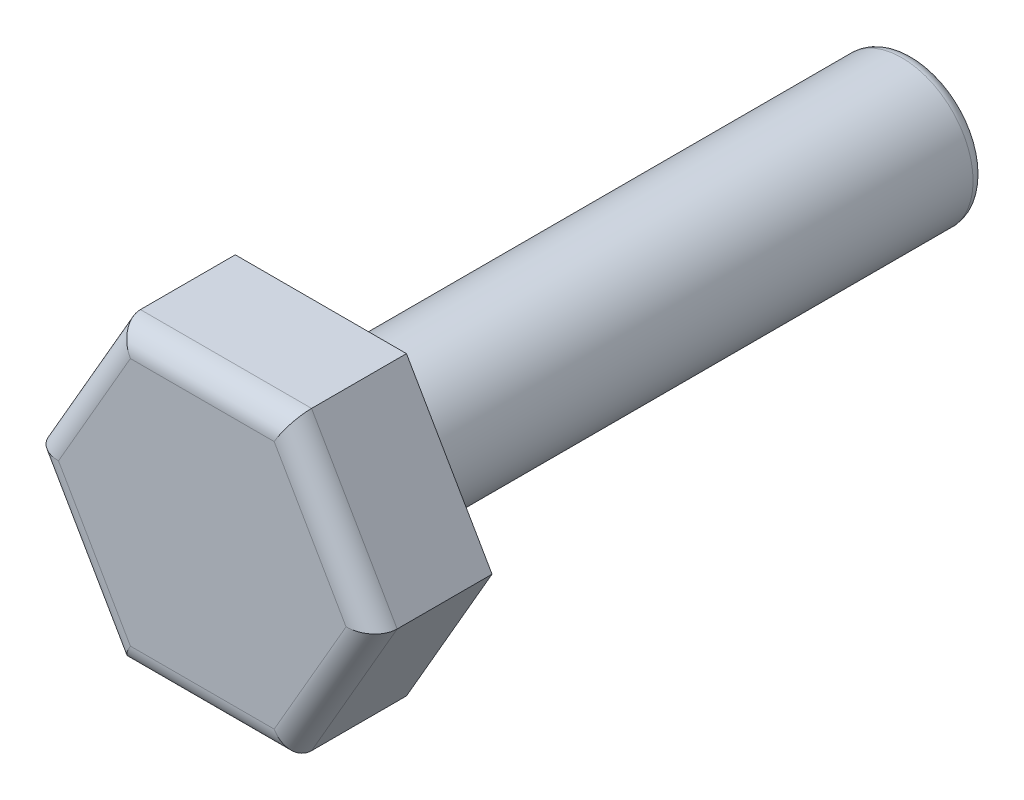
ISO-10303-21;
HEADER;
FILE_DESCRIPTION(('STEP AP214'),'2;1');
FILE_NAME('part.step','',(''),(''),'','','');
FILE_SCHEMA(('AUTOMOTIVE_DESIGN { 1 0 10303 214 1 1 1 1 }'));
ENDSEC;
DATA;
#1=APPLICATION_CONTEXT('core data for automotive mechanical design processes');
#2=APPLICATION_PROTOCOL_DEFINITION('international standard','automotive_design',2000,#1);
#3=PRODUCT_CONTEXT('',#1,'mechanical');
#4=PRODUCT('Part','Part','',(#3));
#5=PRODUCT_RELATED_PRODUCT_CATEGORY('part','',(#4));
#6=PRODUCT_DEFINITION_FORMATION('','',#4);
#7=PRODUCT_DEFINITION_CONTEXT('part definition',#1,'design');
#8=PRODUCT_DEFINITION('design','',#6,#7);
#9=PRODUCT_DEFINITION_SHAPE('','',#8);
#10=(LENGTH_UNIT() NAMED_UNIT(*) SI_UNIT(.MILLI.,.METRE.));
#11=(NAMED_UNIT(*) PLANE_ANGLE_UNIT() SI_UNIT($,.RADIAN.));
#12=(NAMED_UNIT(*) SI_UNIT($,.STERADIAN.) SOLID_ANGLE_UNIT());
#13=UNCERTAINTY_MEASURE_WITH_UNIT(LENGTH_MEASURE(1.E-05),#10,'distance_accuracy_value','');
#14=(GEOMETRIC_REPRESENTATION_CONTEXT(3) GLOBAL_UNCERTAINTY_ASSIGNED_CONTEXT((#13)) GLOBAL_UNIT_ASSIGNED_CONTEXT((#10,
#11,#12)) REPRESENTATION_CONTEXT('',''));
#15=CARTESIAN_POINT('',(0.,0.,0.));
#16=DIRECTION('',(0.,0.,1.));
#17=DIRECTION('',(1.,0.,0.));
#18=AXIS2_PLACEMENT_3D('',#15,#16,#17);
#19=CARTESIAN_POINT('',(0.,0.,60.));
#20=DIRECTION('',(0.,0.,-1.));
#21=DIRECTION('',(-1.,0.,0.));
#22=AXIS2_PLACEMENT_3D('',#19,#20,#21);
#23=CYLINDRICAL_SURFACE('',#22,6.);
#24=CARTESIAN_POINT('',(0.,0.,1.));
#25=DIRECTION('',(0.,0.,1.));
#26=DIRECTION('',(1.,0.,0.));
#27=AXIS2_PLACEMENT_3D('',#24,#25,#26);
#28=CIRCLE('',#27,6.);
#29=CARTESIAN_POINT('',(6.,0.,1.));
#30=VERTEX_POINT('',#29);
#31=EDGE_CURVE('E42',#30,#30,#28,.T.);
#32=ORIENTED_EDGE('',*,*,#31,.T.);
#33=EDGE_LOOP('',(#32));
#34=FACE_BOUND('',#33,.T.);
#35=CARTESIAN_POINT('',(0.,0.,50.));
#36=DIRECTION('',(0.,0.,1.));
#37=DIRECTION('',(1.,0.,0.));
#38=AXIS2_PLACEMENT_3D('',#35,#36,#37);
#39=CIRCLE('',#38,6.);
#40=CARTESIAN_POINT('',(6.,0.,50.));
#41=VERTEX_POINT('',#40);
#42=EDGE_CURVE('E149',#41,#41,#39,.T.);
#43=ORIENTED_EDGE('',*,*,#42,.F.);
#44=EDGE_LOOP('',(#43));
#45=FACE_BOUND('',#44,.T.);
#46=ADVANCED_FACE('F34',(#34,#45),#23,.T.);
#47=CARTESIAN_POINT('',(0.,0.,0.));
#48=DIRECTION('',(0.,0.,1.));
#49=DIRECTION('',(1.,0.,0.));
#50=AXIS2_PLACEMENT_3D('',#47,#48,#49);
#51=PLANE('',#50);
#52=CARTESIAN_POINT('',(0.,0.,0.));
#53=DIRECTION('',(0.,0.,1.));
#54=DIRECTION('',(1.,0.,0.));
#55=AXIS2_PLACEMENT_3D('',#52,#53,#54);
#56=CIRCLE('',#55,5.);
#57=CARTESIAN_POINT('',(5.,0.,0.));
#58=VERTEX_POINT('',#57);
#59=EDGE_CURVE('E11',#58,#58,#56,.F.);
#60=ORIENTED_EDGE('',*,*,#59,.T.);
#61=EDGE_LOOP('',(#60));
#62=FACE_BOUND('',#61,.T.);
#63=ADVANCED_FACE('F208',(#62),#51,.F.);
#64=CARTESIAN_POINT('',(0.,0.,50.));
#65=DIRECTION('',(0.,0.,1.));
#66=DIRECTION('',(1.,0.,0.));
#67=AXIS2_PLACEMENT_3D('',#64,#65,#66);
#68=PLANE('',#67);
#69=DIRECTION('',(1.,0.,0.));
#70=VECTOR('',#69,1.);
#71=CARTESIAN_POINT('',(-7.21687836487032,-12.5,50.));
#72=LINE('',#71,#70);
#73=CARTESIAN_POINT('',(-7.21687836487032,-12.5,50.));
#74=VERTEX_POINT('',#73);
#75=CARTESIAN_POINT('',(7.21687836487032,-12.5,50.));
#76=VERTEX_POINT('',#75);
#77=EDGE_CURVE('E125',#74,#76,#72,.T.);
#78=ORIENTED_EDGE('',*,*,#77,.F.);
#79=DIRECTION('',(0.5,-0.866025403784439,0.));
#80=VECTOR('',#79,1.);
#81=CARTESIAN_POINT('',(-14.4337567297406,0.,50.));
#82=LINE('',#81,#80);
#83=CARTESIAN_POINT('',(-14.4337567297406,0.,50.));
#84=VERTEX_POINT('',#83);
#85=EDGE_CURVE('E117',#84,#74,#82,.T.);
#86=ORIENTED_EDGE('',*,*,#85,.F.);
#87=DIRECTION('',(-0.5,-0.866025403784439,0.));
#88=VECTOR('',#87,1.);
#89=CARTESIAN_POINT('',(-7.21687836487033,12.5,50.));
#90=LINE('',#89,#88);
#91=CARTESIAN_POINT('',(-7.21687836487033,12.5,50.));
#92=VERTEX_POINT('',#91);
#93=EDGE_CURVE('E144',#92,#84,#90,.T.);
#94=ORIENTED_EDGE('',*,*,#93,.F.);
#95=DIRECTION('',(-1.,0.,0.));
#96=VECTOR('',#95,1.);
#97=CARTESIAN_POINT('',(7.21687836487033,12.5,50.));
#98=LINE('',#97,#96);
#99=CARTESIAN_POINT('',(7.21687836487033,12.5,50.));
#100=VERTEX_POINT('',#99);
#101=EDGE_CURVE('E141',#100,#92,#98,.T.);
#102=ORIENTED_EDGE('',*,*,#101,.F.);
#103=DIRECTION('',(-0.5,0.866025403784439,0.));
#104=VECTOR('',#103,1.);
#105=CARTESIAN_POINT('',(14.4337567297406,0.,50.));
#106=LINE('',#105,#104);
#107=CARTESIAN_POINT('',(14.4337567297406,0.,50.));
#108=VERTEX_POINT('',#107);
#109=EDGE_CURVE('E129',#108,#100,#106,.T.);
#110=ORIENTED_EDGE('',*,*,#109,.F.);
#111=DIRECTION('',(0.5,0.866025403784439,0.));
#112=VECTOR('',#111,1.);
#113=CARTESIAN_POINT('',(7.21687836487032,-12.5,50.));
#114=LINE('',#113,#112);
#115=EDGE_CURVE('E111',#76,#108,#114,.T.);
#116=ORIENTED_EDGE('',*,*,#115,.F.);
#117=EDGE_LOOP('',(#78,#86,#94,#102,#110,#116));
#118=FACE_BOUND('',#117,.T.);
#119=ORIENTED_EDGE('',*,*,#42,.T.);
#120=EDGE_LOOP('',(#119));
#121=FACE_BOUND('',#120,.T.);
#122=ADVANCED_FACE('F122',(#118,#121),#68,.F.);
#123=CARTESIAN_POINT('',(-7.21687836487032,-12.5,50.));
#124=DIRECTION('',(0.,-1.,0.));
#125=DIRECTION('',(1.,0.,0.));
#126=AXIS2_PLACEMENT_3D('',#123,#124,#125);
#127=PLANE('',#126);
#128=DIRECTION('',(0.,0.,1.));
#129=VECTOR('',#128,1.);
#130=CARTESIAN_POINT('',(7.21687836487032,-12.5,50.));
#131=LINE('',#130,#129);
#132=CARTESIAN_POINT('',(7.21687836487032,-12.5,58.));
#133=VERTEX_POINT('',#132);
#134=EDGE_CURVE('E107',#76,#133,#131,.T.);
#135=ORIENTED_EDGE('',*,*,#134,.T.);
#136=DIRECTION('',(1.,0.,0.));
#137=VECTOR('',#136,1.);
#138=CARTESIAN_POINT('',(-7.21687836487032,-12.5,58.));
#139=LINE('',#138,#137);
#140=CARTESIAN_POINT('',(-7.21687836487032,-12.5,58.));
#141=VERTEX_POINT('',#140);
#142=EDGE_CURVE('E173',#133,#141,#139,.F.);
#143=ORIENTED_EDGE('',*,*,#142,.T.);
#144=DIRECTION('',(0.,0.,1.));
#145=VECTOR('',#144,1.);
#146=CARTESIAN_POINT('',(-7.21687836487032,-12.5,50.));
#147=LINE('',#146,#145);
#148=EDGE_CURVE('E133',#74,#141,#147,.T.);
#149=ORIENTED_EDGE('',*,*,#148,.F.);
#150=ORIENTED_EDGE('',*,*,#77,.T.);
#151=EDGE_LOOP('',(#135,#143,#149,#150));
#152=FACE_BOUND('',#151,.T.);
#153=ADVANCED_FACE('F131',(#152),#127,.T.);
#154=CARTESIAN_POINT('',(-14.4337567297406,0.,50.));
#155=DIRECTION('',(-0.866025403784439,-0.5,0.));
#156=DIRECTION('',(0.5,-0.866025403784439,0.));
#157=AXIS2_PLACEMENT_3D('',#154,#155,#156);
#158=PLANE('',#157);
#159=ORIENTED_EDGE('',*,*,#148,.T.);
#160=DIRECTION('',(0.5,-0.866025403784439,0.));
#161=VECTOR('',#160,1.);
#162=CARTESIAN_POINT('',(-14.4337567297406,0.,58.));
#163=LINE('',#162,#161);
#164=CARTESIAN_POINT('',(-14.4337567297406,0.,58.));
#165=VERTEX_POINT('',#164);
#166=EDGE_CURVE('E175',#141,#165,#163,.F.);
#167=ORIENTED_EDGE('',*,*,#166,.T.);
#168=DIRECTION('',(0.,0.,1.));
#169=VECTOR('',#168,1.);
#170=CARTESIAN_POINT('',(-14.4337567297406,0.,50.));
#171=LINE('',#170,#169);
#172=EDGE_CURVE('E150',#84,#165,#171,.T.);
#173=ORIENTED_EDGE('',*,*,#172,.F.);
#174=ORIENTED_EDGE('',*,*,#85,.T.);
#175=EDGE_LOOP('',(#159,#167,#173,#174));
#176=FACE_BOUND('',#175,.T.);
#177=ADVANCED_FACE('F256',(#176),#158,.T.);
#178=CARTESIAN_POINT('',(-7.21687836487033,12.5,50.));
#179=DIRECTION('',(-0.866025403784439,0.5,0.));
#180=DIRECTION('',(-0.5,-0.866025403784439,0.));
#181=AXIS2_PLACEMENT_3D('',#178,#179,#180);
#182=PLANE('',#181);
#183=ORIENTED_EDGE('',*,*,#172,.T.);
#184=DIRECTION('',(-0.5,-0.866025403784439,0.));
#185=VECTOR('',#184,1.);
#186=CARTESIAN_POINT('',(-7.21687836487033,12.5,58.));
#187=LINE('',#186,#185);
#188=CARTESIAN_POINT('',(-7.21687836487033,12.5,58.));
#189=VERTEX_POINT('',#188);
#190=EDGE_CURVE('E57',#165,#189,#187,.F.);
#191=ORIENTED_EDGE('',*,*,#190,.T.);
#192=DIRECTION('',(0.,0.,1.));
#193=VECTOR('',#192,1.);
#194=CARTESIAN_POINT('',(-7.21687836487033,12.5,50.));
#195=LINE('',#194,#193);
#196=EDGE_CURVE('E152',#92,#189,#195,.T.);
#197=ORIENTED_EDGE('',*,*,#196,.F.);
#198=ORIENTED_EDGE('',*,*,#93,.T.);
#199=EDGE_LOOP('',(#183,#191,#197,#198));
#200=FACE_BOUND('',#199,.T.);
#201=ADVANCED_FACE('F260',(#200),#182,.T.);
#202=CARTESIAN_POINT('',(7.21687836487033,12.5,50.));
#203=DIRECTION('',(0.,1.,0.));
#204=DIRECTION('',(-1.,0.,0.));
#205=AXIS2_PLACEMENT_3D('',#202,#203,#204);
#206=PLANE('',#205);
#207=ORIENTED_EDGE('',*,*,#196,.T.);
#208=DIRECTION('',(-1.,0.,0.));
#209=VECTOR('',#208,1.);
#210=CARTESIAN_POINT('',(7.21687836487033,12.5,58.));
#211=LINE('',#210,#209);
#212=CARTESIAN_POINT('',(7.21687836487033,12.5,58.));
#213=VERTEX_POINT('',#212);
#214=EDGE_CURVE('E49',#189,#213,#211,.F.);
#215=ORIENTED_EDGE('',*,*,#214,.T.);
#216=DIRECTION('',(0.,0.,1.));
#217=VECTOR('',#216,1.);
#218=CARTESIAN_POINT('',(7.21687836487033,12.5,50.));
#219=LINE('',#218,#217);
#220=EDGE_CURVE('E154',#100,#213,#219,.T.);
#221=ORIENTED_EDGE('',*,*,#220,.F.);
#222=ORIENTED_EDGE('',*,*,#101,.T.);
#223=EDGE_LOOP('',(#207,#215,#221,#222));
#224=FACE_BOUND('',#223,.T.);
#225=ADVANCED_FACE('F259',(#224),#206,.T.);
#226=CARTESIAN_POINT('',(14.4337567297406,0.,50.));
#227=DIRECTION('',(0.866025403784439,0.5,0.));
#228=DIRECTION('',(-0.5,0.866025403784439,0.));
#229=AXIS2_PLACEMENT_3D('',#226,#227,#228);
#230=PLANE('',#229);
#231=ORIENTED_EDGE('',*,*,#220,.T.);
#232=DIRECTION('',(-0.5,0.866025403784439,0.));
#233=VECTOR('',#232,1.);
#234=CARTESIAN_POINT('',(14.4337567297406,0.,58.));
#235=LINE('',#234,#233);
#236=CARTESIAN_POINT('',(14.4337567297406,0.,58.));
#237=VERTEX_POINT('',#236);
#238=EDGE_CURVE('E179',#213,#237,#235,.F.);
#239=ORIENTED_EDGE('',*,*,#238,.T.);
#240=DIRECTION('',(0.,0.,1.));
#241=VECTOR('',#240,1.);
#242=CARTESIAN_POINT('',(14.4337567297406,0.,50.));
#243=LINE('',#242,#241);
#244=EDGE_CURVE('E116',#108,#237,#243,.T.);
#245=ORIENTED_EDGE('',*,*,#244,.F.);
#246=ORIENTED_EDGE('',*,*,#109,.T.);
#247=EDGE_LOOP('',(#231,#239,#245,#246));
#248=FACE_BOUND('',#247,.T.);
#249=ADVANCED_FACE('F248',(#248),#230,.T.);
#250=CARTESIAN_POINT('',(7.21687836487032,-12.5,50.));
#251=DIRECTION('',(0.866025403784439,-0.5,0.));
#252=DIRECTION('',(0.5,0.866025403784439,0.));
#253=AXIS2_PLACEMENT_3D('',#250,#251,#252);
#254=PLANE('',#253);
#255=ORIENTED_EDGE('',*,*,#244,.T.);
#256=DIRECTION('',(0.5,0.866025403784439,0.));
#257=VECTOR('',#256,1.);
#258=CARTESIAN_POINT('',(7.21687836487032,-12.5,58.));
#259=LINE('',#258,#257);
#260=EDGE_CURVE('E113',#237,#133,#259,.F.);
#261=ORIENTED_EDGE('',*,*,#260,.T.);
#262=ORIENTED_EDGE('',*,*,#134,.F.);
#263=ORIENTED_EDGE('',*,*,#115,.T.);
#264=EDGE_LOOP('',(#255,#261,#262,#263));
#265=FACE_BOUND('',#264,.T.);
#266=ADVANCED_FACE('F110',(#265),#254,.T.);
#267=CARTESIAN_POINT('',(0.,0.,60.));
#268=DIRECTION('',(0.,0.,1.));
#269=DIRECTION('',(1.,0.,0.));
#270=AXIS2_PLACEMENT_3D('',#267,#268,#269);
#271=PLANE('',#270);
#272=DIRECTION('',(1.,0.,0.));
#273=VECTOR('',#272,1.);
#274=CARTESIAN_POINT('',(0.,-10.5,60.));
#275=LINE('',#274,#273);
#276=CARTESIAN_POINT('',(-6.06217782649107,-10.5,60.));
#277=VERTEX_POINT('',#276);
#278=CARTESIAN_POINT('',(6.06217782649107,-10.5,60.));
#279=VERTEX_POINT('',#278);
#280=EDGE_CURVE('E167',#277,#279,#275,.T.);
#281=ORIENTED_EDGE('',*,*,#280,.T.);
#282=DIRECTION('',(0.5,0.866025403784439,0.));
#283=VECTOR('',#282,1.);
#284=CARTESIAN_POINT('',(9.0932667397366,-5.25,60.));
#285=LINE('',#284,#283);
#286=CARTESIAN_POINT('',(12.1243556529821,0.,60.));
#287=VERTEX_POINT('',#286);
#288=EDGE_CURVE('E169',#279,#287,#285,.T.);
#289=ORIENTED_EDGE('',*,*,#288,.T.);
#290=DIRECTION('',(-0.5,0.866025403784439,0.));
#291=VECTOR('',#290,1.);
#292=CARTESIAN_POINT('',(9.09326673973661,5.25,60.));
#293=LINE('',#292,#291);
#294=CARTESIAN_POINT('',(6.06217782649108,10.5,60.));
#295=VERTEX_POINT('',#294);
#296=EDGE_CURVE('E159',#287,#295,#293,.T.);
#297=ORIENTED_EDGE('',*,*,#296,.T.);
#298=DIRECTION('',(-1.,0.,0.));
#299=VECTOR('',#298,1.);
#300=CARTESIAN_POINT('',(0.,10.5,60.));
#301=LINE('',#300,#299);
#302=CARTESIAN_POINT('',(-6.06217782649107,10.5,60.));
#303=VERTEX_POINT('',#302);
#304=EDGE_CURVE('E161',#295,#303,#301,.T.);
#305=ORIENTED_EDGE('',*,*,#304,.T.);
#306=DIRECTION('',(-0.5,-0.866025403784439,0.));
#307=VECTOR('',#306,1.);
#308=CARTESIAN_POINT('',(-9.0932667397366,5.25,60.));
#309=LINE('',#308,#307);
#310=CARTESIAN_POINT('',(-12.1243556529821,0.,60.));
#311=VERTEX_POINT('',#310);
#312=EDGE_CURVE('E163',#303,#311,#309,.T.);
#313=ORIENTED_EDGE('',*,*,#312,.T.);
#314=DIRECTION('',(0.5,-0.866025403784439,0.));
#315=VECTOR('',#314,1.);
#316=CARTESIAN_POINT('',(-9.09326673973661,-5.25,60.));
#317=LINE('',#316,#315);
#318=EDGE_CURVE('E165',#311,#277,#317,.T.);
#319=ORIENTED_EDGE('',*,*,#318,.T.);
#320=EDGE_LOOP('',(#281,#289,#297,#305,#313,#319));
#321=FACE_BOUND('',#320,.T.);
#322=ADVANCED_FACE('F233',(#321),#271,.T.);
#323=CARTESIAN_POINT('',(-9.09326673973661,5.25,58.));
#324=DIRECTION('',(-0.5,-0.866025403784439,0.));
#325=DIRECTION('',(0.866025403784439,-0.5,0.));
#326=AXIS2_PLACEMENT_3D('',#323,#324,#325);
#327=CYLINDRICAL_SURFACE('',#326,2.);
#328=CARTESIAN_POINT('',(-6.06217782649107,10.5,58.));
#329=DIRECTION('',(-0.866025403784439,-0.5,0.));
#330=DIRECTION('',(-0.5,0.866025403784439,0.));
#331=AXIS2_PLACEMENT_3D('',#328,#329,#330);
#332=ELLIPSE('',#331,2.3094010767585,2.);
#333=EDGE_CURVE('E137',#189,#303,#332,.F.);
#334=ORIENTED_EDGE('',*,*,#333,.F.);
#335=ORIENTED_EDGE('',*,*,#190,.F.);
#336=CARTESIAN_POINT('',(-12.1243556529821,0.,58.));
#337=DIRECTION('',(0.,-1.,0.));
#338=DIRECTION('',(-1.,0.,0.));
#339=AXIS2_PLACEMENT_3D('',#336,#337,#338);
#340=ELLIPSE('',#339,2.3094010767585,2.);
#341=EDGE_CURVE('E134',#311,#165,#340,.T.);
#342=ORIENTED_EDGE('',*,*,#341,.F.);
#343=ORIENTED_EDGE('',*,*,#312,.F.);
#344=EDGE_LOOP('',(#334,#335,#342,#343));
#345=FACE_BOUND('',#344,.T.);
#346=ADVANCED_FACE('F230',(#345),#327,.T.);
#347=CARTESIAN_POINT('',(-9.09326673973661,-5.25,58.));
#348=DIRECTION('',(0.5,-0.866025403784439,0.));
#349=DIRECTION('',(0.866025403784439,0.5,0.));
#350=AXIS2_PLACEMENT_3D('',#347,#348,#349);
#351=CYLINDRICAL_SURFACE('',#350,2.);
#352=ORIENTED_EDGE('',*,*,#341,.T.);
#353=ORIENTED_EDGE('',*,*,#166,.F.);
#354=CARTESIAN_POINT('',(-6.06217782649107,-10.5,58.));
#355=DIRECTION('',(0.866025403784439,-0.5,0.));
#356=DIRECTION('',(-0.5,-0.866025403784439,0.));
#357=AXIS2_PLACEMENT_3D('',#354,#355,#356);
#358=ELLIPSE('',#357,2.3094010767585,2.);
#359=EDGE_CURVE('E188',#277,#141,#358,.T.);
#360=ORIENTED_EDGE('',*,*,#359,.F.);
#361=ORIENTED_EDGE('',*,*,#318,.F.);
#362=EDGE_LOOP('',(#352,#353,#360,#361));
#363=FACE_BOUND('',#362,.T.);
#364=ADVANCED_FACE('F227',(#363),#351,.T.);
#365=CARTESIAN_POINT('',(0.,10.5,58.));
#366=DIRECTION('',(-1.,0.,0.));
#367=DIRECTION('',(0.,-1.,0.));
#368=AXIS2_PLACEMENT_3D('',#365,#366,#367);
#369=CYLINDRICAL_SURFACE('',#368,2.);
#370=ORIENTED_EDGE('',*,*,#333,.T.);
#371=ORIENTED_EDGE('',*,*,#304,.F.);
#372=CARTESIAN_POINT('',(6.06217782649108,10.5,58.));
#373=DIRECTION('',(-0.866025403784439,0.5,0.));
#374=DIRECTION('',(0.5,0.866025403784439,0.));
#375=AXIS2_PLACEMENT_3D('',#372,#373,#374);
#376=ELLIPSE('',#375,2.3094010767585,2.);
#377=EDGE_CURVE('E185',#213,#295,#376,.F.);
#378=ORIENTED_EDGE('',*,*,#377,.F.);
#379=ORIENTED_EDGE('',*,*,#214,.F.);
#380=EDGE_LOOP('',(#370,#371,#378,#379));
#381=FACE_BOUND('',#380,.T.);
#382=ADVANCED_FACE('F223',(#381),#369,.T.);
#383=CARTESIAN_POINT('',(0.,-10.5,58.));
#384=DIRECTION('',(1.,0.,0.));
#385=DIRECTION('',(0.,1.,0.));
#386=AXIS2_PLACEMENT_3D('',#383,#384,#385);
#387=CYLINDRICAL_SURFACE('',#386,2.);
#388=ORIENTED_EDGE('',*,*,#359,.T.);
#389=ORIENTED_EDGE('',*,*,#142,.F.);
#390=CARTESIAN_POINT('',(6.06217782649107,-10.5,58.));
#391=DIRECTION('',(0.866025403784438,0.5,0.));
#392=DIRECTION('',(0.5,-0.866025403784439,0.));
#393=AXIS2_PLACEMENT_3D('',#390,#391,#392);
#394=ELLIPSE('',#393,2.3094010767585,2.);
#395=EDGE_CURVE('E183',#279,#133,#394,.T.);
#396=ORIENTED_EDGE('',*,*,#395,.F.);
#397=ORIENTED_EDGE('',*,*,#280,.F.);
#398=EDGE_LOOP('',(#388,#389,#396,#397));
#399=FACE_BOUND('',#398,.T.);
#400=ADVANCED_FACE('F219',(#399),#387,.T.);
#401=CARTESIAN_POINT('',(9.09326673973661,5.25,58.));
#402=DIRECTION('',(-0.5,0.866025403784439,0.));
#403=DIRECTION('',(-0.866025403784439,-0.5,0.));
#404=AXIS2_PLACEMENT_3D('',#401,#402,#403);
#405=CYLINDRICAL_SURFACE('',#404,2.);
#406=ORIENTED_EDGE('',*,*,#377,.T.);
#407=ORIENTED_EDGE('',*,*,#296,.F.);
#408=CARTESIAN_POINT('',(12.1243556529821,0.,58.));
#409=DIRECTION('',(0.,1.,0.));
#410=DIRECTION('',(-1.,0.,0.));
#411=AXIS2_PLACEMENT_3D('',#408,#409,#410);
#412=ELLIPSE('',#411,2.3094010767585,2.);
#413=EDGE_CURVE('E181',#237,#287,#412,.F.);
#414=ORIENTED_EDGE('',*,*,#413,.F.);
#415=ORIENTED_EDGE('',*,*,#238,.F.);
#416=EDGE_LOOP('',(#406,#407,#414,#415));
#417=FACE_BOUND('',#416,.T.);
#418=ADVANCED_FACE('F203',(#417),#405,.T.);
#419=CARTESIAN_POINT('',(9.0932667397366,-5.25,58.));
#420=DIRECTION('',(0.5,0.866025403784439,0.));
#421=DIRECTION('',(-0.866025403784439,0.5,0.));
#422=AXIS2_PLACEMENT_3D('',#419,#420,#421);
#423=CYLINDRICAL_SURFACE('',#422,2.);
#424=ORIENTED_EDGE('',*,*,#395,.T.);
#425=ORIENTED_EDGE('',*,*,#260,.F.);
#426=ORIENTED_EDGE('',*,*,#413,.T.);
#427=ORIENTED_EDGE('',*,*,#288,.F.);
#428=EDGE_LOOP('',(#424,#425,#426,#427));
#429=FACE_BOUND('',#428,.T.);
#430=ADVANCED_FACE('F198',(#429),#423,.T.);
#431=CARTESIAN_POINT('',(0.,0.,1.));
#432=DIRECTION('',(0.,0.,1.));
#433=DIRECTION('',(1.,0.,0.));
#434=AXIS2_PLACEMENT_3D('',#431,#432,#433);
#435=TOROIDAL_SURFACE('',#434,5.,1.);
#436=ORIENTED_EDGE('',*,*,#59,.F.);
#437=EDGE_LOOP('',(#436));
#438=FACE_BOUND('',#437,.T.);
#439=ORIENTED_EDGE('',*,*,#31,.F.);
#440=EDGE_LOOP('',(#439));
#441=FACE_BOUND('',#440,.T.);
#442=ADVANCED_FACE('F36',(#438,#441),#435,.T.);
#443=CLOSED_SHELL('',(#46,#63,#122,#153,#177,#201,#225,#249,#266,#322,#346,#364,#382,#400,#418,
#430,#442));
#444=MANIFOLD_SOLID_BREP('B2',#443);
#445=ADVANCED_BREP_SHAPE_REPRESENTATION('',(#18,#444),#14);
#446=SHAPE_DEFINITION_REPRESENTATION(#9,#445);
ENDSEC;
END-ISO-10303-21;
